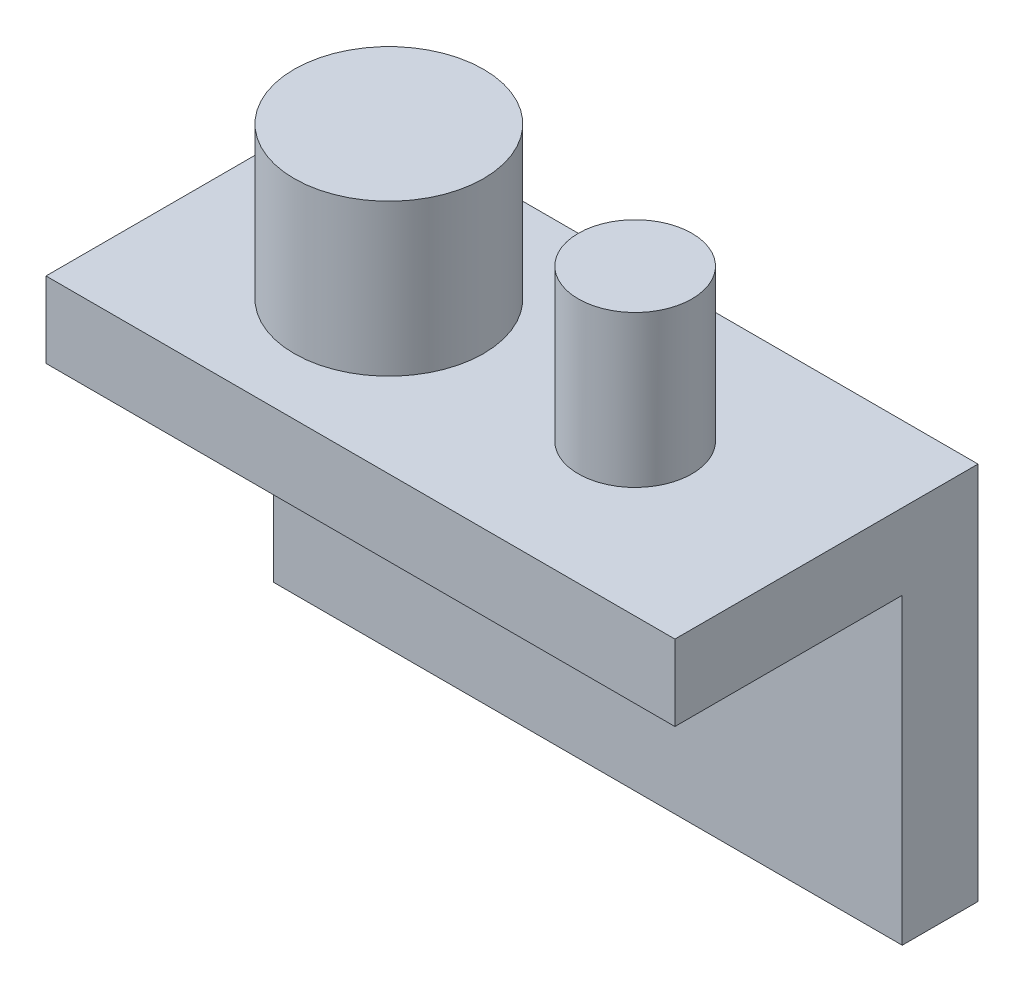
ISO-10303-21;
HEADER;
FILE_DESCRIPTION(('STEP AP214'),'2;1');
FILE_NAME('part.step','',(''),(''),'','','');
FILE_SCHEMA(('AUTOMOTIVE_DESIGN { 1 0 10303 214 1 1 1 1 }'));
ENDSEC;
DATA;
#1=APPLICATION_CONTEXT('core data for automotive mechanical design processes');
#2=APPLICATION_PROTOCOL_DEFINITION('international standard','automotive_design',2000,#1);
#3=PRODUCT_CONTEXT('',#1,'mechanical');
#4=PRODUCT('Part','Part','',(#3));
#5=PRODUCT_RELATED_PRODUCT_CATEGORY('part','',(#4));
#6=PRODUCT_DEFINITION_FORMATION('','',#4);
#7=PRODUCT_DEFINITION_CONTEXT('part definition',#1,'design');
#8=PRODUCT_DEFINITION('design','',#6,#7);
#9=PRODUCT_DEFINITION_SHAPE('','',#8);
#10=(LENGTH_UNIT() NAMED_UNIT(*) SI_UNIT(.MILLI.,.METRE.));
#11=(NAMED_UNIT(*) PLANE_ANGLE_UNIT() SI_UNIT($,.RADIAN.));
#12=(NAMED_UNIT(*) SI_UNIT($,.STERADIAN.) SOLID_ANGLE_UNIT());
#13=UNCERTAINTY_MEASURE_WITH_UNIT(LENGTH_MEASURE(1.E-05),#10,'distance_accuracy_value','');
#14=(GEOMETRIC_REPRESENTATION_CONTEXT(3) GLOBAL_UNCERTAINTY_ASSIGNED_CONTEXT((#13)) GLOBAL_UNIT_ASSIGNED_CONTEXT((#10,
#11,#12)) REPRESENTATION_CONTEXT('',''));
#15=CARTESIAN_POINT('',(0.,0.,0.));
#16=DIRECTION('',(0.,0.,1.));
#17=DIRECTION('',(1.,0.,0.));
#18=AXIS2_PLACEMENT_3D('',#15,#16,#17);
#19=CARTESIAN_POINT('',(8.3,2.,4.));
#20=DIRECTION('',(-1.,0.,0.));
#21=DIRECTION('',(0.,0.,1.));
#22=AXIS2_PLACEMENT_3D('',#19,#20,#21);
#23=PLANE('',#22);
#24=DIRECTION('',(0.,0.,-1.));
#25=VECTOR('',#24,1.);
#26=CARTESIAN_POINT('',(8.3,0.,4.));
#27=LINE('',#26,#25);
#28=CARTESIAN_POINT('',(8.3,0.,4.));
#29=VERTEX_POINT('',#28);
#30=CARTESIAN_POINT('',(8.3,0.,-2.));
#31=VERTEX_POINT('',#30);
#32=EDGE_CURVE('E134',#29,#31,#27,.T.);
#33=ORIENTED_EDGE('',*,*,#32,.T.);
#34=DIRECTION('',(0.,1.,0.));
#35=VECTOR('',#34,1.);
#36=CARTESIAN_POINT('',(8.3,-8.,-2.));
#37=LINE('',#36,#35);
#38=CARTESIAN_POINT('',(8.3,-8.,-2.));
#39=VERTEX_POINT('',#38);
#40=EDGE_CURVE('E125',#39,#31,#37,.T.);
#41=ORIENTED_EDGE('',*,*,#40,.F.);
#42=DIRECTION('',(0.,0.,1.));
#43=VECTOR('',#42,1.);
#44=CARTESIAN_POINT('',(8.3,-8.,-4.));
#45=LINE('',#44,#43);
#46=CARTESIAN_POINT('',(8.3,-8.,-4.));
#47=VERTEX_POINT('',#46);
#48=EDGE_CURVE('E112',#47,#39,#45,.T.);
#49=ORIENTED_EDGE('',*,*,#48,.F.);
#50=DIRECTION('',(0.,-1.,0.));
#51=VECTOR('',#50,1.);
#52=CARTESIAN_POINT('',(8.3,2.,-4.));
#53=LINE('',#52,#51);
#54=CARTESIAN_POINT('',(8.3,2.,-4.));
#55=VERTEX_POINT('',#54);
#56=EDGE_CURVE('E103',#55,#47,#53,.T.);
#57=ORIENTED_EDGE('',*,*,#56,.F.);
#58=DIRECTION('',(0.,0.,-1.));
#59=VECTOR('',#58,1.);
#60=CARTESIAN_POINT('',(8.3,2.,4.));
#61=LINE('',#60,#59);
#62=CARTESIAN_POINT('',(8.3,2.,4.));
#63=VERTEX_POINT('',#62);
#64=EDGE_CURVE('E135',#63,#55,#61,.T.);
#65=ORIENTED_EDGE('',*,*,#64,.F.);
#66=DIRECTION('',(0.,-1.,0.));
#67=VECTOR('',#66,1.);
#68=CARTESIAN_POINT('',(8.3,2.,4.));
#69=LINE('',#68,#67);
#70=EDGE_CURVE('E140',#63,#29,#69,.T.);
#71=ORIENTED_EDGE('',*,*,#70,.T.);
#72=EDGE_LOOP('',(#33,#41,#49,#57,#65,#71));
#73=FACE_BOUND('',#72,.T.);
#74=ADVANCED_FACE('F33',(#73),#23,.F.);
#75=CARTESIAN_POINT('',(-8.3,2.,-4.));
#76=DIRECTION('',(0.,0.,1.));
#77=DIRECTION('',(1.,0.,0.));
#78=AXIS2_PLACEMENT_3D('',#75,#76,#77);
#79=PLANE('',#78);
#80=ORIENTED_EDGE('',*,*,#56,.T.);
#81=DIRECTION('',(1.,0.,0.));
#82=VECTOR('',#81,1.);
#83=CARTESIAN_POINT('',(-8.3,-8.,-4.));
#84=LINE('',#83,#82);
#85=CARTESIAN_POINT('',(-8.3,-8.,-4.));
#86=VERTEX_POINT('',#85);
#87=EDGE_CURVE('E107',#86,#47,#84,.T.);
#88=ORIENTED_EDGE('',*,*,#87,.F.);
#89=DIRECTION('',(0.,-1.,0.));
#90=VECTOR('',#89,1.);
#91=CARTESIAN_POINT('',(-8.3,2.,-4.));
#92=LINE('',#91,#90);
#93=CARTESIAN_POINT('',(-8.3,2.,-4.));
#94=VERTEX_POINT('',#93);
#95=EDGE_CURVE('E95',#94,#86,#92,.T.);
#96=ORIENTED_EDGE('',*,*,#95,.F.);
#97=DIRECTION('',(-1.,0.,0.));
#98=VECTOR('',#97,1.);
#99=CARTESIAN_POINT('',(-8.3,2.,-4.));
#100=LINE('',#99,#98);
#101=EDGE_CURVE('E79',#55,#94,#100,.T.);
#102=ORIENTED_EDGE('',*,*,#101,.F.);
#103=EDGE_LOOP('',(#80,#88,#96,#102));
#104=FACE_BOUND('',#103,.T.);
#105=ADVANCED_FACE('F108',(#104),#79,.F.);
#106=CARTESIAN_POINT('',(-8.3,2.,4.));
#107=DIRECTION('',(1.,0.,0.));
#108=DIRECTION('',(0.,0.,-1.));
#109=AXIS2_PLACEMENT_3D('',#106,#107,#108);
#110=PLANE('',#109);
#111=ORIENTED_EDGE('',*,*,#95,.T.);
#112=DIRECTION('',(0.,0.,-1.));
#113=VECTOR('',#112,1.);
#114=CARTESIAN_POINT('',(-8.3,-8.,-4.));
#115=LINE('',#114,#113);
#116=CARTESIAN_POINT('',(-8.3,-8.,-2.));
#117=VERTEX_POINT('',#116);
#118=EDGE_CURVE('E100',#117,#86,#115,.T.);
#119=ORIENTED_EDGE('',*,*,#118,.F.);
#120=DIRECTION('',(0.,1.,0.));
#121=VECTOR('',#120,1.);
#122=CARTESIAN_POINT('',(-8.3,-8.,-2.));
#123=LINE('',#122,#121);
#124=CARTESIAN_POINT('',(-8.3,0.,-2.));
#125=VERTEX_POINT('',#124);
#126=EDGE_CURVE('E122',#117,#125,#123,.T.);
#127=ORIENTED_EDGE('',*,*,#126,.T.);
#128=DIRECTION('',(0.,0.,1.));
#129=VECTOR('',#128,1.);
#130=CARTESIAN_POINT('',(-8.3,0.,4.));
#131=LINE('',#130,#129);
#132=CARTESIAN_POINT('',(-8.3,0.,4.));
#133=VERTEX_POINT('',#132);
#134=EDGE_CURVE('E142',#125,#133,#131,.T.);
#135=ORIENTED_EDGE('',*,*,#134,.T.);
#136=DIRECTION('',(0.,-1.,0.));
#137=VECTOR('',#136,1.);
#138=CARTESIAN_POINT('',(-8.3,2.,4.));
#139=LINE('',#138,#137);
#140=CARTESIAN_POINT('',(-8.3,2.,4.));
#141=VERTEX_POINT('',#140);
#142=EDGE_CURVE('E104',#141,#133,#139,.T.);
#143=ORIENTED_EDGE('',*,*,#142,.F.);
#144=DIRECTION('',(0.,0.,1.));
#145=VECTOR('',#144,1.);
#146=CARTESIAN_POINT('',(-8.3,2.,4.));
#147=LINE('',#146,#145);
#148=EDGE_CURVE('E102',#94,#141,#147,.T.);
#149=ORIENTED_EDGE('',*,*,#148,.F.);
#150=EDGE_LOOP('',(#111,#119,#127,#135,#143,#149));
#151=FACE_BOUND('',#150,.T.);
#152=ADVANCED_FACE('F97',(#151),#110,.F.);
#153=CARTESIAN_POINT('',(-8.3,2.,4.));
#154=DIRECTION('',(0.,0.,-1.));
#155=DIRECTION('',(-1.,0.,0.));
#156=AXIS2_PLACEMENT_3D('',#153,#154,#155);
#157=PLANE('',#156);
#158=DIRECTION('',(1.,0.,0.));
#159=VECTOR('',#158,1.);
#160=CARTESIAN_POINT('',(-8.3,0.,4.));
#161=LINE('',#160,#159);
#162=EDGE_CURVE('E71',#133,#29,#161,.T.);
#163=ORIENTED_EDGE('',*,*,#162,.T.);
#164=ORIENTED_EDGE('',*,*,#70,.F.);
#165=DIRECTION('',(1.,0.,0.));
#166=VECTOR('',#165,1.);
#167=CARTESIAN_POINT('',(-8.3,2.,4.));
#168=LINE('',#167,#166);
#169=EDGE_CURVE('E56',#141,#63,#168,.T.);
#170=ORIENTED_EDGE('',*,*,#169,.F.);
#171=ORIENTED_EDGE('',*,*,#142,.T.);
#172=EDGE_LOOP('',(#163,#164,#170,#171));
#173=FACE_BOUND('',#172,.T.);
#174=ADVANCED_FACE('F155',(#173),#157,.F.);
#175=CARTESIAN_POINT('',(0.,2.,0.));
#176=DIRECTION('',(0.,-1.,0.));
#177=DIRECTION('',(0.,0.,-1.));
#178=AXIS2_PLACEMENT_3D('',#175,#176,#177);
#179=PLANE('',#178);
#180=CARTESIAN_POINT('',(3.25,2.,0.));
#181=DIRECTION('',(0.,-1.,0.));
#182=DIRECTION('',(0.,0.,-1.));
#183=AXIS2_PLACEMENT_3D('',#180,#181,#182);
#184=CIRCLE('',#183,1.5);
#185=CARTESIAN_POINT('',(3.25,2.,-1.5));
#186=VERTEX_POINT('',#185);
#187=EDGE_CURVE('E11',#186,#186,#184,.F.);
#188=ORIENTED_EDGE('',*,*,#187,.F.);
#189=EDGE_LOOP('',(#188));
#190=FACE_BOUND('',#189,.T.);
#191=CARTESIAN_POINT('',(-3.25,2.,0.));
#192=DIRECTION('',(0.,-1.,0.));
#193=DIRECTION('',(0.,0.,-1.));
#194=AXIS2_PLACEMENT_3D('',#191,#192,#193);
#195=CIRCLE('',#194,2.5);
#196=CARTESIAN_POINT('',(-3.25,2.,-2.5));
#197=VERTEX_POINT('',#196);
#198=EDGE_CURVE('E40',#197,#197,#195,.F.);
#199=ORIENTED_EDGE('',*,*,#198,.F.);
#200=EDGE_LOOP('',(#199));
#201=FACE_BOUND('',#200,.T.);
#202=ORIENTED_EDGE('',*,*,#64,.T.);
#203=ORIENTED_EDGE('',*,*,#101,.T.);
#204=ORIENTED_EDGE('',*,*,#148,.T.);
#205=ORIENTED_EDGE('',*,*,#169,.T.);
#206=EDGE_LOOP('',(#202,#203,#204,#205));
#207=FACE_BOUND('',#206,.T.);
#208=ADVANCED_FACE('F152',(#190,#201,#207),#179,.F.);
#209=CARTESIAN_POINT('',(0.,0.,0.));
#210=DIRECTION('',(0.,-1.,0.));
#211=DIRECTION('',(0.,0.,-1.));
#212=AXIS2_PLACEMENT_3D('',#209,#210,#211);
#213=PLANE('',#212);
#214=DIRECTION('',(-1.,0.,0.));
#215=VECTOR('',#214,1.);
#216=CARTESIAN_POINT('',(-8.3,0.,-2.));
#217=LINE('',#216,#215);
#218=EDGE_CURVE('E47',#31,#125,#217,.T.);
#219=ORIENTED_EDGE('',*,*,#218,.F.);
#220=ORIENTED_EDGE('',*,*,#32,.F.);
#221=ORIENTED_EDGE('',*,*,#162,.F.);
#222=ORIENTED_EDGE('',*,*,#134,.F.);
#223=EDGE_LOOP('',(#219,#220,#221,#222));
#224=FACE_BOUND('',#223,.T.);
#225=ADVANCED_FACE('F154',(#224),#213,.T.);
#226=CARTESIAN_POINT('',(-3.25,6.,0.));
#227=DIRECTION('',(0.,-1.,0.));
#228=DIRECTION('',(0.,0.,-1.));
#229=AXIS2_PLACEMENT_3D('',#226,#227,#228);
#230=CYLINDRICAL_SURFACE('',#229,2.5);
#231=CARTESIAN_POINT('',(-3.25,6.,0.));
#232=DIRECTION('',(0.,1.,0.));
#233=DIRECTION('',(0.,0.,1.));
#234=AXIS2_PLACEMENT_3D('',#231,#232,#233);
#235=CIRCLE('',#234,2.5);
#236=CARTESIAN_POINT('',(-3.25,6.,2.5));
#237=VERTEX_POINT('',#236);
#238=EDGE_CURVE('E131',#237,#237,#235,.T.);
#239=ORIENTED_EDGE('',*,*,#238,.F.);
#240=EDGE_LOOP('',(#239));
#241=FACE_BOUND('',#240,.T.);
#242=ORIENTED_EDGE('',*,*,#198,.T.);
#243=EDGE_LOOP('',(#242));
#244=FACE_BOUND('',#243,.T.);
#245=ADVANCED_FACE('F150',(#241,#244),#230,.T.);
#246=CARTESIAN_POINT('',(-3.25,6.,0.));
#247=DIRECTION('',(0.,1.,0.));
#248=DIRECTION('',(0.,0.,1.));
#249=AXIS2_PLACEMENT_3D('',#246,#247,#248);
#250=PLANE('',#249);
#251=ORIENTED_EDGE('',*,*,#238,.T.);
#252=EDGE_LOOP('',(#251));
#253=FACE_BOUND('',#252,.T.);
#254=ADVANCED_FACE('F168',(#253),#250,.T.);
#255=CARTESIAN_POINT('',(3.25,6.,0.));
#256=DIRECTION('',(0.,-1.,0.));
#257=DIRECTION('',(0.,0.,-1.));
#258=AXIS2_PLACEMENT_3D('',#255,#256,#257);
#259=CYLINDRICAL_SURFACE('',#258,1.5);
#260=CARTESIAN_POINT('',(3.25,6.,0.));
#261=DIRECTION('',(0.,1.,0.));
#262=DIRECTION('',(0.,0.,1.));
#263=AXIS2_PLACEMENT_3D('',#260,#261,#262);
#264=CIRCLE('',#263,1.5);
#265=CARTESIAN_POINT('',(3.25,6.,1.5));
#266=VERTEX_POINT('',#265);
#267=EDGE_CURVE('E128',#266,#266,#264,.T.);
#268=ORIENTED_EDGE('',*,*,#267,.F.);
#269=EDGE_LOOP('',(#268));
#270=FACE_BOUND('',#269,.T.);
#271=ORIENTED_EDGE('',*,*,#187,.T.);
#272=EDGE_LOOP('',(#271));
#273=FACE_BOUND('',#272,.T.);
#274=ADVANCED_FACE('F205',(#270,#273),#259,.T.);
#275=CARTESIAN_POINT('',(3.25,6.,0.));
#276=DIRECTION('',(0.,1.,0.));
#277=DIRECTION('',(0.,0.,1.));
#278=AXIS2_PLACEMENT_3D('',#275,#276,#277);
#279=PLANE('',#278);
#280=ORIENTED_EDGE('',*,*,#267,.T.);
#281=EDGE_LOOP('',(#280));
#282=FACE_BOUND('',#281,.T.);
#283=ADVANCED_FACE('F215',(#282),#279,.T.);
#284=CARTESIAN_POINT('',(-8.3,-8.,-2.));
#285=DIRECTION('',(0.,0.,-1.));
#286=DIRECTION('',(-1.,0.,0.));
#287=AXIS2_PLACEMENT_3D('',#284,#285,#286);
#288=PLANE('',#287);
#289=ORIENTED_EDGE('',*,*,#218,.T.);
#290=ORIENTED_EDGE('',*,*,#126,.F.);
#291=DIRECTION('',(-1.,0.,0.));
#292=VECTOR('',#291,1.);
#293=CARTESIAN_POINT('',(-8.3,-8.,-2.));
#294=LINE('',#293,#292);
#295=EDGE_CURVE('E116',#39,#117,#294,.T.);
#296=ORIENTED_EDGE('',*,*,#295,.F.);
#297=ORIENTED_EDGE('',*,*,#40,.T.);
#298=EDGE_LOOP('',(#289,#290,#296,#297));
#299=FACE_BOUND('',#298,.T.);
#300=ADVANCED_FACE('F162',(#299),#288,.F.);
#301=CARTESIAN_POINT('',(0.,-8.,0.));
#302=DIRECTION('',(0.,1.,0.));
#303=DIRECTION('',(0.,0.,1.));
#304=AXIS2_PLACEMENT_3D('',#301,#302,#303);
#305=PLANE('',#304);
#306=ORIENTED_EDGE('',*,*,#118,.T.);
#307=ORIENTED_EDGE('',*,*,#87,.T.);
#308=ORIENTED_EDGE('',*,*,#48,.T.);
#309=ORIENTED_EDGE('',*,*,#295,.T.);
#310=EDGE_LOOP('',(#306,#307,#308,#309));
#311=FACE_BOUND('',#310,.T.);
#312=ADVANCED_FACE('F114',(#311),#305,.F.);
#313=CLOSED_SHELL('',(#74,#105,#152,#174,#208,#225,#245,#254,#274,#283,#300,#312));
#314=MANIFOLD_SOLID_BREP('B2',#313);
#315=ADVANCED_BREP_SHAPE_REPRESENTATION('',(#18,#314),#14);
#316=SHAPE_DEFINITION_REPRESENTATION(#9,#315);
ENDSEC;
END-ISO-10303-21;
